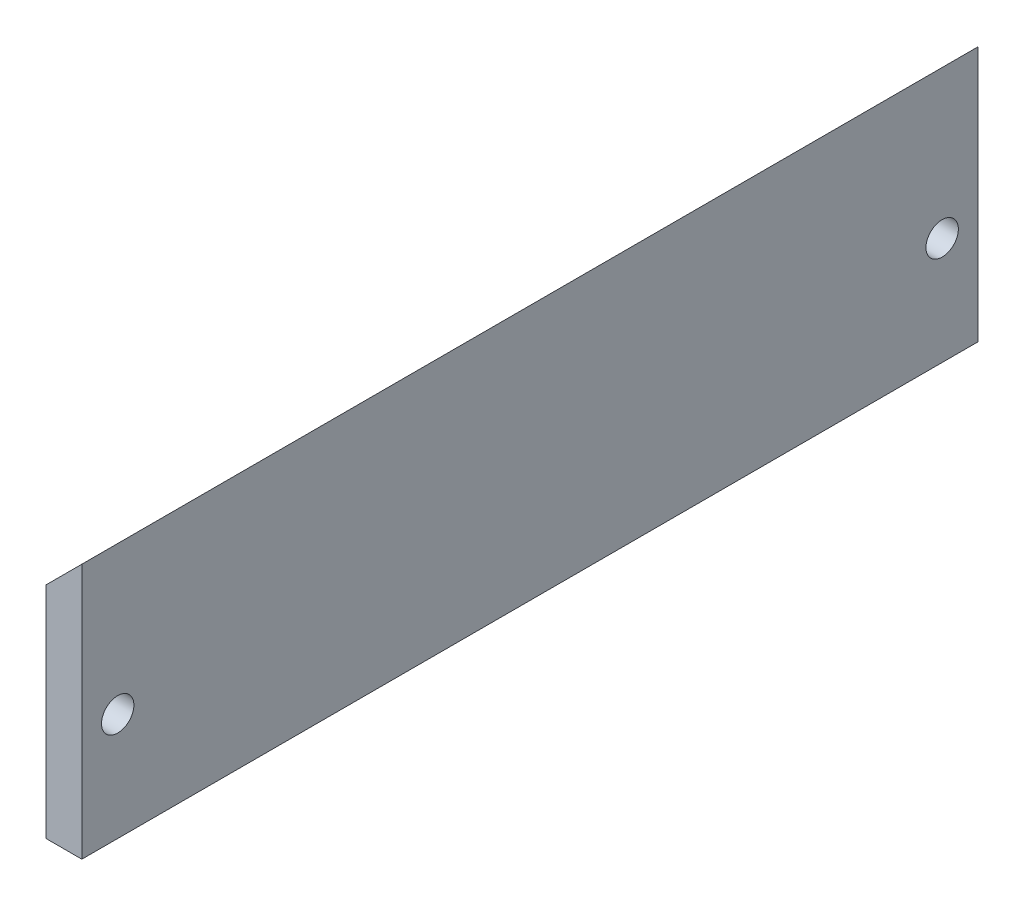
ISO-10303-21;
HEADER;
FILE_DESCRIPTION(('STEP AP214'),'2;1');
FILE_NAME('part.step','',(''),(''),'','','');
FILE_SCHEMA(('AUTOMOTIVE_DESIGN { 1 0 10303 214 1 1 1 1 }'));
ENDSEC;
DATA;
#1=APPLICATION_CONTEXT('core data for automotive mechanical design processes');
#2=APPLICATION_PROTOCOL_DEFINITION('international standard','automotive_design',2000,#1);
#3=PRODUCT_CONTEXT('',#1,'mechanical');
#4=PRODUCT('Part','Part','',(#3));
#5=PRODUCT_RELATED_PRODUCT_CATEGORY('part','',(#4));
#6=PRODUCT_DEFINITION_FORMATION('','',#4);
#7=PRODUCT_DEFINITION_CONTEXT('part definition',#1,'design');
#8=PRODUCT_DEFINITION('design','',#6,#7);
#9=PRODUCT_DEFINITION_SHAPE('','',#8);
#10=(LENGTH_UNIT() NAMED_UNIT(*) SI_UNIT(.MILLI.,.METRE.));
#11=(NAMED_UNIT(*) PLANE_ANGLE_UNIT() SI_UNIT($,.RADIAN.));
#12=(NAMED_UNIT(*) SI_UNIT($,.STERADIAN.) SOLID_ANGLE_UNIT());
#13=UNCERTAINTY_MEASURE_WITH_UNIT(LENGTH_MEASURE(1.E-05),#10,'distance_accuracy_value','');
#14=(GEOMETRIC_REPRESENTATION_CONTEXT(3) GLOBAL_UNCERTAINTY_ASSIGNED_CONTEXT((#13)) GLOBAL_UNIT_ASSIGNED_CONTEXT((#10,
#11,#12)) REPRESENTATION_CONTEXT('',''));
#15=CARTESIAN_POINT('',(0.,0.,0.));
#16=DIRECTION('',(0.,0.,1.));
#17=DIRECTION('',(1.,0.,0.));
#18=AXIS2_PLACEMENT_3D('',#15,#16,#17);
#19=CARTESIAN_POINT('',(-6.35,0.,-39.6875));
#20=DIRECTION('',(0.,0.,-1.));
#21=DIRECTION('',(-1.,0.,0.));
#22=AXIS2_PLACEMENT_3D('',#19,#20,#21);
#23=PLANE('',#22);
#24=DIRECTION('',(0.707106781186551,0.707106781186544,0.));
#25=VECTOR('',#24,1.);
#26=CARTESIAN_POINT('',(0.,22.6314,-39.6875));
#27=LINE('',#26,#25);
#28=CARTESIAN_POINT('',(-3.175,19.4564,-39.6875));
#29=VERTEX_POINT('',#28);
#30=CARTESIAN_POINT('',(0.,22.6314,-39.6875));
#31=VERTEX_POINT('',#30);
#32=EDGE_CURVE('E161',#29,#31,#27,.T.);
#33=ORIENTED_EDGE('',*,*,#32,.T.);
#34=DIRECTION('',(0.,1.,0.));
#35=VECTOR('',#34,1.);
#36=CARTESIAN_POINT('',(0.,0.,-39.6875));
#37=LINE('',#36,#35);
#38=CARTESIAN_POINT('',(0.,0.,-39.6875));
#39=VERTEX_POINT('',#38);
#40=EDGE_CURVE('E188',#39,#31,#37,.T.);
#41=ORIENTED_EDGE('',*,*,#40,.F.);
#42=DIRECTION('',(1.,0.,0.));
#43=VECTOR('',#42,1.);
#44=CARTESIAN_POINT('',(-6.35,0.,-39.6875));
#45=LINE('',#44,#43);
#46=CARTESIAN_POINT('',(-3.175,0.,-39.6875));
#47=VERTEX_POINT('',#46);
#48=EDGE_CURVE('E46',#47,#39,#45,.T.);
#49=ORIENTED_EDGE('',*,*,#48,.F.);
#50=DIRECTION('',(0.,-1.,0.));
#51=VECTOR('',#50,1.);
#52=CARTESIAN_POINT('',(-3.175,22.6314,-39.6875));
#53=LINE('',#52,#51);
#54=EDGE_CURVE('E172',#29,#47,#53,.T.);
#55=ORIENTED_EDGE('',*,*,#54,.F.);
#56=EDGE_LOOP('',(#33,#41,#49,#55));
#57=FACE_BOUND('',#56,.T.);
#58=ADVANCED_FACE('F38',(#57),#23,.T.);
#59=CARTESIAN_POINT('',(-6.35,0.,0.));
#60=DIRECTION('',(0.,-1.,0.));
#61=DIRECTION('',(0.,0.,-1.));
#62=AXIS2_PLACEMENT_3D('',#59,#60,#61);
#63=PLANE('',#62);
#64=CARTESIAN_POINT('',(-3.175,0.,-20.6375));
#65=DIRECTION('',(0.,-1.,0.));
#66=DIRECTION('',(0.,0.,-1.));
#67=AXIS2_PLACEMENT_3D('',#64,#65,#66);
#68=CIRCLE('',#67,1.13029999999999);
#69=CARTESIAN_POINT('',(-3.175,0.,-21.7678));
#70=VERTEX_POINT('',#69);
#71=EDGE_CURVE('E155',#70,#70,#68,.T.);
#72=ORIENTED_EDGE('',*,*,#71,.F.);
#73=EDGE_LOOP('',(#72));
#74=FACE_BOUND('',#73,.T.);
#75=DIRECTION('',(-1.,0.,0.));
#76=VECTOR('',#75,1.);
#77=CARTESIAN_POINT('',(-6.35,0.,-33.3375));
#78=LINE('',#77,#76);
#79=CARTESIAN_POINT('',(-3.175,0.,-33.3375));
#80=VERTEX_POINT('',#79);
#81=CARTESIAN_POINT('',(-6.35,0.,-33.3375));
#82=VERTEX_POINT('',#81);
#83=EDGE_CURVE('E170',#80,#82,#78,.T.);
#84=ORIENTED_EDGE('',*,*,#83,.F.);
#85=DIRECTION('',(0.,0.,1.));
#86=VECTOR('',#85,1.);
#87=CARTESIAN_POINT('',(-3.175,0.,-39.6875));
#88=LINE('',#87,#86);
#89=EDGE_CURVE('E167',#47,#80,#88,.T.);
#90=ORIENTED_EDGE('',*,*,#89,.F.);
#91=ORIENTED_EDGE('',*,*,#48,.T.);
#92=DIRECTION('',(0.,0.,-1.));
#93=VECTOR('',#92,1.);
#94=CARTESIAN_POINT('',(0.,0.,0.));
#95=LINE('',#94,#93);
#96=CARTESIAN_POINT('',(0.,0.,39.6875));
#97=VERTEX_POINT('',#96);
#98=EDGE_CURVE('E181',#97,#39,#95,.T.);
#99=ORIENTED_EDGE('',*,*,#98,.F.);
#100=DIRECTION('',(1.,0.,0.));
#101=VECTOR('',#100,1.);
#102=CARTESIAN_POINT('',(-6.35,0.,39.6875));
#103=LINE('',#102,#101);
#104=CARTESIAN_POINT('',(-3.175,0.,39.6875));
#105=VERTEX_POINT('',#104);
#106=EDGE_CURVE('E148',#105,#97,#103,.T.);
#107=ORIENTED_EDGE('',*,*,#106,.F.);
#108=DIRECTION('',(0.,0.,-1.));
#109=VECTOR('',#108,1.);
#110=CARTESIAN_POINT('',(-3.175,0.,39.6875));
#111=LINE('',#110,#109);
#112=CARTESIAN_POINT('',(-3.175,0.,33.3375));
#113=VERTEX_POINT('',#112);
#114=EDGE_CURVE('E127',#105,#113,#111,.T.);
#115=ORIENTED_EDGE('',*,*,#114,.T.);
#116=DIRECTION('',(-1.,0.,0.));
#117=VECTOR('',#116,1.);
#118=CARTESIAN_POINT('',(-6.35,0.,33.3375));
#119=LINE('',#118,#117);
#120=CARTESIAN_POINT('',(-6.35,0.,33.3375));
#121=VERTEX_POINT('',#120);
#122=EDGE_CURVE('E130',#113,#121,#119,.T.);
#123=ORIENTED_EDGE('',*,*,#122,.T.);
#124=DIRECTION('',(0.,0.,-1.));
#125=VECTOR('',#124,1.);
#126=CARTESIAN_POINT('',(-6.35,0.,0.));
#127=LINE('',#126,#125);
#128=EDGE_CURVE('E182',#121,#82,#127,.T.);
#129=ORIENTED_EDGE('',*,*,#128,.T.);
#130=EDGE_LOOP('',(#84,#90,#91,#99,#107,#115,#123,#129));
#131=FACE_BOUND('',#130,.T.);
#132=CARTESIAN_POINT('',(-3.175,0.,20.6375));
#133=DIRECTION('',(0.,1.,0.));
#134=DIRECTION('',(0.,0.,1.));
#135=AXIS2_PLACEMENT_3D('',#132,#133,#134);
#136=CIRCLE('',#135,1.13029999999999);
#137=CARTESIAN_POINT('',(-3.175,0.,21.7678));
#138=VERTEX_POINT('',#137);
#139=EDGE_CURVE('E118',#138,#138,#136,.T.);
#140=ORIENTED_EDGE('',*,*,#139,.T.);
#141=EDGE_LOOP('',(#140));
#142=FACE_BOUND('',#141,.T.);
#143=ADVANCED_FACE('F40',(#74,#131,#142),#63,.T.);
#144=CARTESIAN_POINT('',(-6.35,22.6314,0.));
#145=DIRECTION('',(-1.,0.,0.));
#146=DIRECTION('',(0.,0.,1.));
#147=AXIS2_PLACEMENT_3D('',#144,#145,#146);
#148=PLANE('',#147);
#149=DIRECTION('',(0.,0.,1.));
#150=VECTOR('',#149,1.);
#151=CARTESIAN_POINT('',(-6.35,16.2814000000001,-39.6875));
#152=LINE('',#151,#150);
#153=CARTESIAN_POINT('',(-6.35,16.2814000000001,-33.3375));
#154=VERTEX_POINT('',#153);
#155=CARTESIAN_POINT('',(-6.35,16.2814000000001,33.3375));
#156=VERTEX_POINT('',#155);
#157=EDGE_CURVE('E164',#154,#156,#152,.T.);
#158=ORIENTED_EDGE('',*,*,#157,.F.);
#159=DIRECTION('',(0.,-1.,0.));
#160=VECTOR('',#159,1.);
#161=CARTESIAN_POINT('',(-6.35,22.6314,-33.3375));
#162=LINE('',#161,#160);
#163=EDGE_CURVE('E60',#154,#82,#162,.T.);
#164=ORIENTED_EDGE('',*,*,#163,.T.);
#165=ORIENTED_EDGE('',*,*,#128,.F.);
#166=DIRECTION('',(0.,-1.,0.));
#167=VECTOR('',#166,1.);
#168=CARTESIAN_POINT('',(-6.35,22.6314,33.3375));
#169=LINE('',#168,#167);
#170=EDGE_CURVE('E134',#156,#121,#169,.T.);
#171=ORIENTED_EDGE('',*,*,#170,.F.);
#172=EDGE_LOOP('',(#158,#164,#165,#171));
#173=FACE_BOUND('',#172,.T.);
#174=ADVANCED_FACE('F218',(#173),#148,.T.);
#175=CARTESIAN_POINT('',(0.,22.6314,0.));
#176=DIRECTION('',(-1.,0.,0.));
#177=DIRECTION('',(0.,0.,1.));
#178=AXIS2_PLACEMENT_3D('',#175,#176,#177);
#179=PLANE('',#178);
#180=CARTESIAN_POINT('',(0.,9.525,-36.5125));
#181=DIRECTION('',(1.,0.,0.));
#182=DIRECTION('',(0.,0.,-1.));
#183=AXIS2_PLACEMENT_3D('',#180,#181,#182);
#184=CIRCLE('',#183,1.4351);
#185=CARTESIAN_POINT('',(0.,9.525,-37.9476));
#186=VERTEX_POINT('',#185);
#187=EDGE_CURVE('E178',#186,#186,#184,.T.);
#188=ORIENTED_EDGE('',*,*,#187,.F.);
#189=EDGE_LOOP('',(#188));
#190=FACE_BOUND('',#189,.T.);
#191=DIRECTION('',(0.,0.,1.));
#192=VECTOR('',#191,1.);
#193=CARTESIAN_POINT('',(0.,22.6314,0.));
#194=LINE('',#193,#192);
#195=CARTESIAN_POINT('',(0.,22.6314,39.6875));
#196=VERTEX_POINT('',#195);
#197=EDGE_CURVE('E185',#31,#196,#194,.T.);
#198=ORIENTED_EDGE('',*,*,#197,.T.);
#199=DIRECTION('',(0.,1.,0.));
#200=VECTOR('',#199,1.);
#201=CARTESIAN_POINT('',(0.,0.,39.6875));
#202=LINE('',#201,#200);
#203=EDGE_CURVE('E145',#97,#196,#202,.T.);
#204=ORIENTED_EDGE('',*,*,#203,.F.);
#205=ORIENTED_EDGE('',*,*,#98,.T.);
#206=ORIENTED_EDGE('',*,*,#40,.T.);
#207=EDGE_LOOP('',(#198,#204,#205,#206));
#208=FACE_BOUND('',#207,.T.);
#209=CARTESIAN_POINT('',(0.,9.525,36.5125));
#210=DIRECTION('',(-1.,0.,0.));
#211=DIRECTION('',(0.,0.,1.));
#212=AXIS2_PLACEMENT_3D('',#209,#210,#211);
#213=CIRCLE('',#212,1.4351);
#214=CARTESIAN_POINT('',(0.,9.525,37.9476));
#215=VERTEX_POINT('',#214);
#216=EDGE_CURVE('E142',#215,#215,#213,.T.);
#217=ORIENTED_EDGE('',*,*,#216,.T.);
#218=EDGE_LOOP('',(#217));
#219=FACE_BOUND('',#218,.T.);
#220=ADVANCED_FACE('F210',(#190,#208,#219),#179,.F.);
#221=CARTESIAN_POINT('',(-6.35,9.525,-36.5125));
#222=DIRECTION('',(1.,0.,0.));
#223=DIRECTION('',(0.,0.,-1.));
#224=AXIS2_PLACEMENT_3D('',#221,#222,#223);
#225=CYLINDRICAL_SURFACE('',#224,1.4351);
#226=CARTESIAN_POINT('',(-3.175,9.525,-36.5125));
#227=DIRECTION('',(1.,0.,0.));
#228=DIRECTION('',(0.,0.,-1.));
#229=AXIS2_PLACEMENT_3D('',#226,#227,#228);
#230=CIRCLE('',#229,1.4351);
#231=CARTESIAN_POINT('',(-3.175,9.525,-37.9476));
#232=VERTEX_POINT('',#231);
#233=EDGE_CURVE('E174',#232,#232,#230,.F.);
#234=ORIENTED_EDGE('',*,*,#233,.T.);
#235=EDGE_LOOP('',(#234));
#236=FACE_BOUND('',#235,.T.);
#237=ORIENTED_EDGE('',*,*,#187,.T.);
#238=EDGE_LOOP('',(#237));
#239=FACE_BOUND('',#238,.T.);
#240=ADVANCED_FACE('F195',(#236,#239),#225,.F.);
#241=CARTESIAN_POINT('',(-3.175,22.6314,-39.6875));
#242=DIRECTION('',(1.,0.,0.));
#243=DIRECTION('',(0.,0.,-1.));
#244=AXIS2_PLACEMENT_3D('',#241,#242,#243);
#245=PLANE('',#244);
#246=DIRECTION('',(0.,-1.,0.));
#247=VECTOR('',#246,1.);
#248=CARTESIAN_POINT('',(-3.175,22.6314,-33.3375));
#249=LINE('',#248,#247);
#250=CARTESIAN_POINT('',(-3.175,19.4564,-33.3375));
#251=VERTEX_POINT('',#250);
#252=EDGE_CURVE('E175',#251,#80,#249,.T.);
#253=ORIENTED_EDGE('',*,*,#252,.F.);
#254=DIRECTION('',(0.,0.,-1.));
#255=VECTOR('',#254,1.);
#256=CARTESIAN_POINT('',(-3.175,19.4564,-39.6875));
#257=LINE('',#256,#255);
#258=EDGE_CURVE('E53',#251,#29,#257,.T.);
#259=ORIENTED_EDGE('',*,*,#258,.T.);
#260=ORIENTED_EDGE('',*,*,#54,.T.);
#261=ORIENTED_EDGE('',*,*,#89,.T.);
#262=EDGE_LOOP('',(#253,#259,#260,#261));
#263=FACE_BOUND('',#262,.T.);
#264=ORIENTED_EDGE('',*,*,#233,.F.);
#265=EDGE_LOOP('',(#264));
#266=FACE_BOUND('',#265,.T.);
#267=ADVANCED_FACE('F198',(#263,#266),#245,.F.);
#268=CARTESIAN_POINT('',(-6.35,22.6314,-33.3375));
#269=DIRECTION('',(0.,0.,1.));
#270=DIRECTION('',(1.,0.,0.));
#271=AXIS2_PLACEMENT_3D('',#268,#269,#270);
#272=PLANE('',#271);
#273=ORIENTED_EDGE('',*,*,#163,.F.);
#274=DIRECTION('',(0.707106781186551,0.707106781186544,0.));
#275=VECTOR('',#274,1.);
#276=CARTESIAN_POINT('',(-3.17500000000003,19.4564,-33.3375));
#277=LINE('',#276,#275);
#278=EDGE_CURVE('E11',#154,#251,#277,.T.);
#279=ORIENTED_EDGE('',*,*,#278,.T.);
#280=ORIENTED_EDGE('',*,*,#252,.T.);
#281=ORIENTED_EDGE('',*,*,#83,.T.);
#282=EDGE_LOOP('',(#273,#279,#280,#281));
#283=FACE_BOUND('',#282,.T.);
#284=ADVANCED_FACE('F200',(#283),#272,.F.);
#285=CARTESIAN_POINT('',(0.,22.6314,-39.6875));
#286=DIRECTION('',(0.707106781186544,-0.707106781186551,0.));
#287=DIRECTION('',(0.707106781186551,0.707106781186544,0.));
#288=AXIS2_PLACEMENT_3D('',#285,#286,#287);
#289=PLANE('',#288);
#290=ORIENTED_EDGE('',*,*,#278,.F.);
#291=ORIENTED_EDGE('',*,*,#157,.T.);
#292=DIRECTION('',(0.707106781186551,0.707106781186544,0.));
#293=VECTOR('',#292,1.);
#294=CARTESIAN_POINT('',(-3.17500000000003,19.4564,33.3375));
#295=LINE('',#294,#293);
#296=CARTESIAN_POINT('',(-3.175,19.4564,33.3375));
#297=VERTEX_POINT('',#296);
#298=EDGE_CURVE('E151',#156,#297,#295,.T.);
#299=ORIENTED_EDGE('',*,*,#298,.T.);
#300=DIRECTION('',(0.,0.,1.));
#301=VECTOR('',#300,1.);
#302=CARTESIAN_POINT('',(-3.175,19.4564,39.6875));
#303=LINE('',#302,#301);
#304=CARTESIAN_POINT('',(-3.175,19.4564,39.6875));
#305=VERTEX_POINT('',#304);
#306=EDGE_CURVE('E121',#297,#305,#303,.T.);
#307=ORIENTED_EDGE('',*,*,#306,.T.);
#308=DIRECTION('',(0.707106781186551,0.707106781186544,0.));
#309=VECTOR('',#308,1.);
#310=CARTESIAN_POINT('',(0.,22.6314,39.6875));
#311=LINE('',#310,#309);
#312=EDGE_CURVE('E117',#305,#196,#311,.T.);
#313=ORIENTED_EDGE('',*,*,#312,.T.);
#314=ORIENTED_EDGE('',*,*,#197,.F.);
#315=ORIENTED_EDGE('',*,*,#32,.F.);
#316=ORIENTED_EDGE('',*,*,#258,.F.);
#317=EDGE_LOOP('',(#290,#291,#299,#307,#313,#314,#315,#316));
#318=FACE_BOUND('',#317,.T.);
#319=ADVANCED_FACE('F207',(#318),#289,.F.);
#320=CARTESIAN_POINT('',(-3.175,9.65199999999999,-20.6375));
#321=DIRECTION('',(0.,-1.,0.));
#322=DIRECTION('',(0.,0.,-1.));
#323=AXIS2_PLACEMENT_3D('',#320,#321,#322);
#324=CONICAL_SURFACE('',#323,1.13029999999999,1.02974425867665);
#325=CARTESIAN_POINT('',(-3.175,10.3311527576868,-20.6375));
#326=VERTEX_POINT('',#325);
#327=VERTEX_LOOP('',#326);
#328=FACE_BOUND('',#327,.T.);
#329=CARTESIAN_POINT('',(-3.175,9.65199999999999,-20.6375));
#330=DIRECTION('',(0.,-1.,0.));
#331=DIRECTION('',(0.,0.,-1.));
#332=AXIS2_PLACEMENT_3D('',#329,#330,#331);
#333=CIRCLE('',#332,1.13029999999999);
#334=CARTESIAN_POINT('',(-3.175,9.65199999999999,-21.7678));
#335=VERTEX_POINT('',#334);
#336=EDGE_CURVE('E158',#335,#335,#333,.T.);
#337=ORIENTED_EDGE('',*,*,#336,.T.);
#338=EDGE_LOOP('',(#337));
#339=FACE_BOUND('',#338,.T.);
#340=ADVANCED_FACE('F269',(#328,#339),#324,.F.);
#341=CARTESIAN_POINT('',(-3.175,0.,-20.6375));
#342=DIRECTION('',(0.,-1.,0.));
#343=DIRECTION('',(0.,0.,-1.));
#344=AXIS2_PLACEMENT_3D('',#341,#342,#343);
#345=CYLINDRICAL_SURFACE('',#344,1.13029999999999);
#346=ORIENTED_EDGE('',*,*,#336,.F.);
#347=EDGE_LOOP('',(#346));
#348=FACE_BOUND('',#347,.T.);
#349=ORIENTED_EDGE('',*,*,#71,.T.);
#350=EDGE_LOOP('',(#349));
#351=FACE_BOUND('',#350,.T.);
#352=ADVANCED_FACE('F262',(#348,#351),#345,.F.);
#353=CARTESIAN_POINT('',(-6.35,0.,39.6875));
#354=DIRECTION('',(0.,0.,1.));
#355=DIRECTION('',(-1.,0.,0.));
#356=AXIS2_PLACEMENT_3D('',#353,#354,#355);
#357=PLANE('',#356);
#358=ORIENTED_EDGE('',*,*,#312,.F.);
#359=DIRECTION('',(0.,-1.,0.));
#360=VECTOR('',#359,1.);
#361=CARTESIAN_POINT('',(-3.175,22.6314,39.6875));
#362=LINE('',#361,#360);
#363=EDGE_CURVE('E133',#305,#105,#362,.T.);
#364=ORIENTED_EDGE('',*,*,#363,.T.);
#365=ORIENTED_EDGE('',*,*,#106,.T.);
#366=ORIENTED_EDGE('',*,*,#203,.T.);
#367=EDGE_LOOP('',(#358,#364,#365,#366));
#368=FACE_BOUND('',#367,.T.);
#369=ADVANCED_FACE('F244',(#368),#357,.T.);
#370=CARTESIAN_POINT('',(-6.35,9.525,36.5125));
#371=DIRECTION('',(1.,0.,0.));
#372=DIRECTION('',(0.,0.,1.));
#373=AXIS2_PLACEMENT_3D('',#370,#371,#372);
#374=CYLINDRICAL_SURFACE('',#373,1.4351);
#375=CARTESIAN_POINT('',(-3.175,9.525,36.5125));
#376=DIRECTION('',(-1.,0.,0.));
#377=DIRECTION('',(0.,0.,1.));
#378=AXIS2_PLACEMENT_3D('',#375,#376,#377);
#379=CIRCLE('',#378,1.4351);
#380=CARTESIAN_POINT('',(-3.175,9.525,37.9476));
#381=VERTEX_POINT('',#380);
#382=EDGE_CURVE('E137',#381,#381,#379,.F.);
#383=ORIENTED_EDGE('',*,*,#382,.F.);
#384=EDGE_LOOP('',(#383));
#385=FACE_BOUND('',#384,.T.);
#386=ORIENTED_EDGE('',*,*,#216,.F.);
#387=EDGE_LOOP('',(#386));
#388=FACE_BOUND('',#387,.T.);
#389=ADVANCED_FACE('F253',(#385,#388),#374,.F.);
#390=CARTESIAN_POINT('',(-3.175,22.6314,39.6875));
#391=DIRECTION('',(1.,0.,0.));
#392=DIRECTION('',(0.,0.,1.));
#393=AXIS2_PLACEMENT_3D('',#390,#391,#392);
#394=PLANE('',#393);
#395=DIRECTION('',(0.,-1.,0.));
#396=VECTOR('',#395,1.);
#397=CARTESIAN_POINT('',(-3.175,22.6314,33.3375));
#398=LINE('',#397,#396);
#399=EDGE_CURVE('E138',#297,#113,#398,.T.);
#400=ORIENTED_EDGE('',*,*,#399,.T.);
#401=ORIENTED_EDGE('',*,*,#114,.F.);
#402=ORIENTED_EDGE('',*,*,#363,.F.);
#403=ORIENTED_EDGE('',*,*,#306,.F.);
#404=EDGE_LOOP('',(#400,#401,#402,#403));
#405=FACE_BOUND('',#404,.T.);
#406=ORIENTED_EDGE('',*,*,#382,.T.);
#407=EDGE_LOOP('',(#406));
#408=FACE_BOUND('',#407,.T.);
#409=ADVANCED_FACE('F239',(#405,#408),#394,.F.);
#410=CARTESIAN_POINT('',(-6.35,22.6314,33.3375));
#411=DIRECTION('',(0.,0.,-1.));
#412=DIRECTION('',(1.,0.,0.));
#413=AXIS2_PLACEMENT_3D('',#410,#411,#412);
#414=PLANE('',#413);
#415=ORIENTED_EDGE('',*,*,#170,.T.);
#416=ORIENTED_EDGE('',*,*,#122,.F.);
#417=ORIENTED_EDGE('',*,*,#399,.F.);
#418=ORIENTED_EDGE('',*,*,#298,.F.);
#419=EDGE_LOOP('',(#415,#416,#417,#418));
#420=FACE_BOUND('',#419,.T.);
#421=ADVANCED_FACE('F111',(#420),#414,.F.);
#422=CARTESIAN_POINT('',(-3.175,9.65199999999999,20.6375));
#423=DIRECTION('',(0.,-1.,0.));
#424=DIRECTION('',(0.,0.,1.));
#425=AXIS2_PLACEMENT_3D('',#422,#423,#424);
#426=CONICAL_SURFACE('',#425,1.13029999999999,1.02974425867665);
#427=CARTESIAN_POINT('',(-3.175,10.3311527576868,20.6375));
#428=VERTEX_POINT('',#427);
#429=VERTEX_LOOP('',#428);
#430=FACE_BOUND('',#429,.T.);
#431=CARTESIAN_POINT('',(-3.175,9.65199999999999,20.6375));
#432=DIRECTION('',(0.,1.,0.));
#433=DIRECTION('',(0.,0.,1.));
#434=AXIS2_PLACEMENT_3D('',#431,#432,#433);
#435=CIRCLE('',#434,1.13029999999999);
#436=CARTESIAN_POINT('',(-3.175,9.65199999999999,21.7678));
#437=VERTEX_POINT('',#436);
#438=EDGE_CURVE('E115',#437,#437,#435,.T.);
#439=ORIENTED_EDGE('',*,*,#438,.F.);
#440=EDGE_LOOP('',(#439));
#441=FACE_BOUND('',#440,.T.);
#442=ADVANCED_FACE('F107',(#430,#441),#426,.F.);
#443=CARTESIAN_POINT('',(-3.175,0.,20.6375));
#444=DIRECTION('',(0.,-1.,0.));
#445=DIRECTION('',(0.,0.,1.));
#446=AXIS2_PLACEMENT_3D('',#443,#444,#445);
#447=CYLINDRICAL_SURFACE('',#446,1.13029999999999);
#448=ORIENTED_EDGE('',*,*,#438,.T.);
#449=EDGE_LOOP('',(#448));
#450=FACE_BOUND('',#449,.T.);
#451=ORIENTED_EDGE('',*,*,#139,.F.);
#452=EDGE_LOOP('',(#451));
#453=FACE_BOUND('',#452,.T.);
#454=ADVANCED_FACE('F110',(#450,#453),#447,.F.);
#455=CLOSED_SHELL('',(#58,#143,#174,#220,#240,#267,#284,#319,#340,#352,#369,#389,#409,#421,#442,#454));
#456=MANIFOLD_SOLID_BREP('B2',#455);
#457=ADVANCED_BREP_SHAPE_REPRESENTATION('',(#18,#456),#14);
#458=SHAPE_DEFINITION_REPRESENTATION(#9,#457);
ENDSEC;
END-ISO-10303-21;
